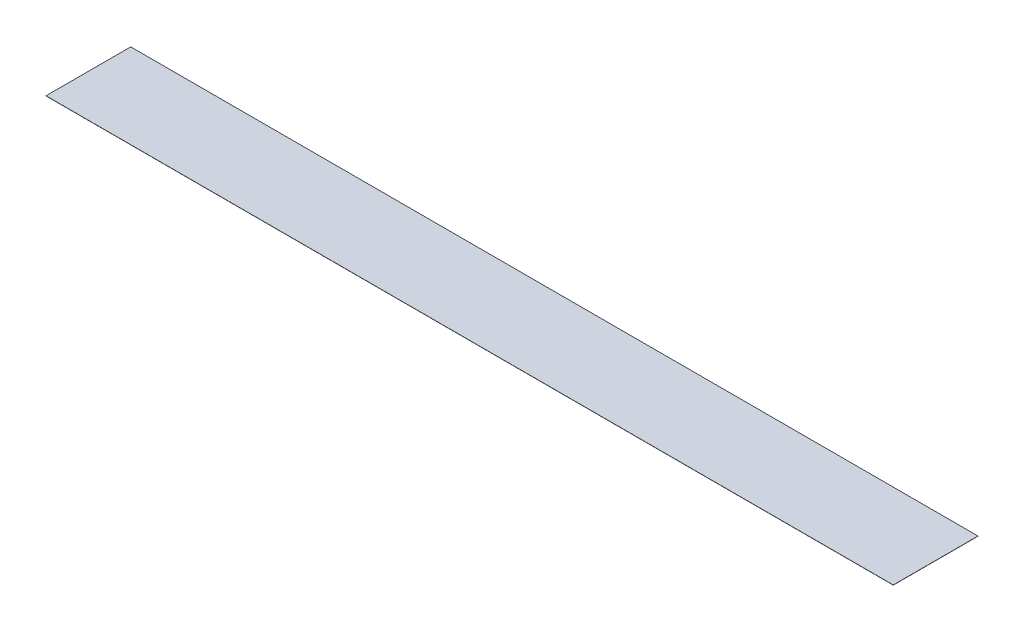
ISO-10303-21;
HEADER;
FILE_DESCRIPTION(('STEP AP214'),'2;1');
FILE_NAME('part.step','',(''),(''),'','','');
FILE_SCHEMA(('AUTOMOTIVE_DESIGN { 1 0 10303 214 1 1 1 1 }'));
ENDSEC;
DATA;
#1=APPLICATION_CONTEXT('core data for automotive mechanical design processes');
#2=APPLICATION_PROTOCOL_DEFINITION('international standard','automotive_design',2000,#1);
#3=PRODUCT_CONTEXT('',#1,'mechanical');
#4=PRODUCT('Part','Part','',(#3));
#5=PRODUCT_RELATED_PRODUCT_CATEGORY('part','',(#4));
#6=PRODUCT_DEFINITION_FORMATION('','',#4);
#7=PRODUCT_DEFINITION_CONTEXT('part definition',#1,'design');
#8=PRODUCT_DEFINITION('design','',#6,#7);
#9=PRODUCT_DEFINITION_SHAPE('','',#8);
#10=(LENGTH_UNIT() NAMED_UNIT(*) SI_UNIT(.MILLI.,.METRE.));
#11=(NAMED_UNIT(*) PLANE_ANGLE_UNIT() SI_UNIT($,.RADIAN.));
#12=(NAMED_UNIT(*) SI_UNIT($,.STERADIAN.) SOLID_ANGLE_UNIT());
#13=UNCERTAINTY_MEASURE_WITH_UNIT(LENGTH_MEASURE(1.E-05),#10,'distance_accuracy_value','');
#14=(GEOMETRIC_REPRESENTATION_CONTEXT(3) GLOBAL_UNCERTAINTY_ASSIGNED_CONTEXT((#13)) GLOBAL_UNIT_ASSIGNED_CONTEXT((#10,
#11,#12)) REPRESENTATION_CONTEXT('',''));
#15=CARTESIAN_POINT('',(0.,0.,0.));
#16=DIRECTION('',(0.,0.,1.));
#17=DIRECTION('',(1.,0.,0.));
#18=AXIS2_PLACEMENT_3D('',#15,#16,#17);
#19=CARTESIAN_POINT('',(6349.99999999999,2.54,-635.));
#20=DIRECTION('',(-1.,0.,0.));
#21=DIRECTION('',(0.,0.,1.));
#22=AXIS2_PLACEMENT_3D('',#19,#20,#21);
#23=PLANE('',#22);
#24=DIRECTION('',(0.,0.,-1.));
#25=VECTOR('',#24,1.);
#26=CARTESIAN_POINT('',(6349.99999999999,0.,-635.));
#27=LINE('',#26,#25);
#28=CARTESIAN_POINT('',(6349.99999999999,0.,635.));
#29=VERTEX_POINT('',#28);
#30=CARTESIAN_POINT('',(6349.99999999999,0.,-635.));
#31=VERTEX_POINT('',#30);
#32=EDGE_CURVE('E96',#29,#31,#27,.T.);
#33=ORIENTED_EDGE('',*,*,#32,.T.);
#34=DIRECTION('',(0.,-1.,0.));
#35=VECTOR('',#34,1.);
#36=CARTESIAN_POINT('',(6349.99999999999,2.54,-635.));
#37=LINE('',#36,#35);
#38=CARTESIAN_POINT('',(6349.99999999999,2.54,-635.));
#39=VERTEX_POINT('',#38);
#40=EDGE_CURVE('E11',#39,#31,#37,.T.);
#41=ORIENTED_EDGE('',*,*,#40,.F.);
#42=DIRECTION('',(0.,0.,-1.));
#43=VECTOR('',#42,1.);
#44=CARTESIAN_POINT('',(6349.99999999999,2.54,-635.));
#45=LINE('',#44,#43);
#46=CARTESIAN_POINT('',(6349.99999999999,2.54,635.));
#47=VERTEX_POINT('',#46);
#48=EDGE_CURVE('E84',#47,#39,#45,.T.);
#49=ORIENTED_EDGE('',*,*,#48,.F.);
#50=DIRECTION('',(0.,-1.,0.));
#51=VECTOR('',#50,1.);
#52=CARTESIAN_POINT('',(6349.99999999999,2.54,635.));
#53=LINE('',#52,#51);
#54=EDGE_CURVE('E92',#47,#29,#53,.T.);
#55=ORIENTED_EDGE('',*,*,#54,.T.);
#56=EDGE_LOOP('',(#33,#41,#49,#55));
#57=FACE_BOUND('',#56,.T.);
#58=ADVANCED_FACE('F33',(#57),#23,.F.);
#59=CARTESIAN_POINT('',(-6350.,2.54,-635.));
#60=DIRECTION('',(0.,0.,1.));
#61=DIRECTION('',(1.,0.,0.));
#62=AXIS2_PLACEMENT_3D('',#59,#60,#61);
#63=PLANE('',#62);
#64=DIRECTION('',(-1.,0.,0.));
#65=VECTOR('',#64,1.);
#66=CARTESIAN_POINT('',(-6350.,0.,-635.));
#67=LINE('',#66,#65);
#68=CARTESIAN_POINT('',(-6350.,0.,-635.));
#69=VERTEX_POINT('',#68);
#70=EDGE_CURVE('E88',#31,#69,#67,.T.);
#71=ORIENTED_EDGE('',*,*,#70,.T.);
#72=DIRECTION('',(0.,-1.,0.));
#73=VECTOR('',#72,1.);
#74=CARTESIAN_POINT('',(-6350.,2.54,-635.));
#75=LINE('',#74,#73);
#76=CARTESIAN_POINT('',(-6350.,2.54,-635.));
#77=VERTEX_POINT('',#76);
#78=EDGE_CURVE('E41',#77,#69,#75,.T.);
#79=ORIENTED_EDGE('',*,*,#78,.F.);
#80=DIRECTION('',(-1.,0.,0.));
#81=VECTOR('',#80,1.);
#82=CARTESIAN_POINT('',(-6350.,2.54,-635.));
#83=LINE('',#82,#81);
#84=EDGE_CURVE('E79',#39,#77,#83,.T.);
#85=ORIENTED_EDGE('',*,*,#84,.F.);
#86=ORIENTED_EDGE('',*,*,#40,.T.);
#87=EDGE_LOOP('',(#71,#79,#85,#86));
#88=FACE_BOUND('',#87,.T.);
#89=ADVANCED_FACE('F87',(#88),#63,.F.);
#90=CARTESIAN_POINT('',(-6350.,2.54,-635.));
#91=DIRECTION('',(1.,0.,0.));
#92=DIRECTION('',(0.,0.,-1.));
#93=AXIS2_PLACEMENT_3D('',#90,#91,#92);
#94=PLANE('',#93);
#95=DIRECTION('',(0.,0.,1.));
#96=VECTOR('',#95,1.);
#97=CARTESIAN_POINT('',(-6350.,0.,-635.));
#98=LINE('',#97,#96);
#99=CARTESIAN_POINT('',(-6350.,0.,635.));
#100=VERTEX_POINT('',#99);
#101=EDGE_CURVE('E66',#69,#100,#98,.T.);
#102=ORIENTED_EDGE('',*,*,#101,.T.);
#103=DIRECTION('',(0.,-1.,0.));
#104=VECTOR('',#103,1.);
#105=CARTESIAN_POINT('',(-6350.,2.54,635.));
#106=LINE('',#105,#104);
#107=CARTESIAN_POINT('',(-6350.,2.54,635.));
#108=VERTEX_POINT('',#107);
#109=EDGE_CURVE('E89',#108,#100,#106,.T.);
#110=ORIENTED_EDGE('',*,*,#109,.F.);
#111=DIRECTION('',(0.,0.,1.));
#112=VECTOR('',#111,1.);
#113=CARTESIAN_POINT('',(-6350.,2.54,-635.));
#114=LINE('',#113,#112);
#115=EDGE_CURVE('E82',#77,#108,#114,.T.);
#116=ORIENTED_EDGE('',*,*,#115,.F.);
#117=ORIENTED_EDGE('',*,*,#78,.T.);
#118=EDGE_LOOP('',(#102,#110,#116,#117));
#119=FACE_BOUND('',#118,.T.);
#120=ADVANCED_FACE('F90',(#119),#94,.F.);
#121=CARTESIAN_POINT('',(-6350.,2.54,635.));
#122=DIRECTION('',(0.,0.,-1.));
#123=DIRECTION('',(-1.,0.,0.));
#124=AXIS2_PLACEMENT_3D('',#121,#122,#123);
#125=PLANE('',#124);
#126=DIRECTION('',(1.,0.,0.));
#127=VECTOR('',#126,1.);
#128=CARTESIAN_POINT('',(-6350.,0.,635.));
#129=LINE('',#128,#127);
#130=EDGE_CURVE('E72',#100,#29,#129,.T.);
#131=ORIENTED_EDGE('',*,*,#130,.T.);
#132=ORIENTED_EDGE('',*,*,#54,.F.);
#133=DIRECTION('',(1.,0.,0.));
#134=VECTOR('',#133,1.);
#135=CARTESIAN_POINT('',(-6350.,2.54,635.));
#136=LINE('',#135,#134);
#137=EDGE_CURVE('E49',#108,#47,#136,.T.);
#138=ORIENTED_EDGE('',*,*,#137,.F.);
#139=ORIENTED_EDGE('',*,*,#109,.T.);
#140=EDGE_LOOP('',(#131,#132,#138,#139));
#141=FACE_BOUND('',#140,.T.);
#142=ADVANCED_FACE('F103',(#141),#125,.F.);
#143=CARTESIAN_POINT('',(0.,2.54,0.));
#144=DIRECTION('',(0.,1.,0.));
#145=DIRECTION('',(0.,0.,1.));
#146=AXIS2_PLACEMENT_3D('',#143,#144,#145);
#147=PLANE('',#146);
#148=ORIENTED_EDGE('',*,*,#48,.T.);
#149=ORIENTED_EDGE('',*,*,#84,.T.);
#150=ORIENTED_EDGE('',*,*,#115,.T.);
#151=ORIENTED_EDGE('',*,*,#137,.T.);
#152=EDGE_LOOP('',(#148,#149,#150,#151));
#153=FACE_BOUND('',#152,.T.);
#154=ADVANCED_FACE('F80',(#153),#147,.T.);
#155=CARTESIAN_POINT('',(0.,0.,0.));
#156=DIRECTION('',(0.,1.,0.));
#157=DIRECTION('',(0.,0.,1.));
#158=AXIS2_PLACEMENT_3D('',#155,#156,#157);
#159=PLANE('',#158);
#160=ORIENTED_EDGE('',*,*,#32,.F.);
#161=ORIENTED_EDGE('',*,*,#130,.F.);
#162=ORIENTED_EDGE('',*,*,#101,.F.);
#163=ORIENTED_EDGE('',*,*,#70,.F.);
#164=EDGE_LOOP('',(#160,#161,#162,#163));
#165=FACE_BOUND('',#164,.T.);
#166=ADVANCED_FACE('F106',(#165),#159,.F.);
#167=CLOSED_SHELL('',(#58,#89,#120,#142,#154,#166));
#168=MANIFOLD_SOLID_BREP('B2',#167);
#169=ADVANCED_BREP_SHAPE_REPRESENTATION('',(#18,#168),#14);
#170=SHAPE_DEFINITION_REPRESENTATION(#9,#169);
ENDSEC;
END-ISO-10303-21;
